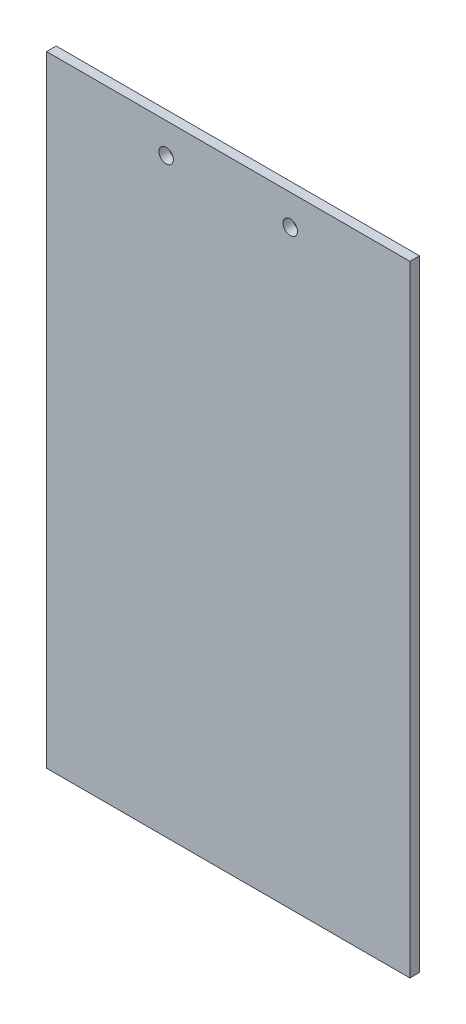
ISO-10303-21;
HEADER;
FILE_DESCRIPTION(('STEP AP214'),'2;1');
FILE_NAME('part.step','',(''),(''),'','','');
FILE_SCHEMA(('AUTOMOTIVE_DESIGN { 1 0 10303 214 1 1 1 1 }'));
ENDSEC;
DATA;
#1=APPLICATION_CONTEXT('core data for automotive mechanical design processes');
#2=APPLICATION_PROTOCOL_DEFINITION('international standard','automotive_design',2000,#1);
#3=PRODUCT_CONTEXT('',#1,'mechanical');
#4=PRODUCT('Part','Part','',(#3));
#5=PRODUCT_RELATED_PRODUCT_CATEGORY('part','',(#4));
#6=PRODUCT_DEFINITION_FORMATION('','',#4);
#7=PRODUCT_DEFINITION_CONTEXT('part definition',#1,'design');
#8=PRODUCT_DEFINITION('design','',#6,#7);
#9=PRODUCT_DEFINITION_SHAPE('','',#8);
#10=(LENGTH_UNIT() NAMED_UNIT(*) SI_UNIT(.MILLI.,.METRE.));
#11=(NAMED_UNIT(*) PLANE_ANGLE_UNIT() SI_UNIT($,.RADIAN.));
#12=(NAMED_UNIT(*) SI_UNIT($,.STERADIAN.) SOLID_ANGLE_UNIT());
#13=UNCERTAINTY_MEASURE_WITH_UNIT(LENGTH_MEASURE(1.E-05),#10,'distance_accuracy_value','');
#14=(GEOMETRIC_REPRESENTATION_CONTEXT(3) GLOBAL_UNCERTAINTY_ASSIGNED_CONTEXT((#13)) GLOBAL_UNIT_ASSIGNED_CONTEXT((#10,
#11,#12)) REPRESENTATION_CONTEXT('',''));
#15=CARTESIAN_POINT('',(0.,0.,0.));
#16=DIRECTION('',(0.,0.,1.));
#17=DIRECTION('',(1.,0.,0.));
#18=AXIS2_PLACEMENT_3D('',#15,#16,#17);
#19=CARTESIAN_POINT('',(0.,0.,6.35));
#20=DIRECTION('',(1.,0.,0.));
#21=DIRECTION('',(0.,1.,0.));
#22=AXIS2_PLACEMENT_3D('',#19,#20,#21);
#23=PLANE('',#22);
#24=DIRECTION('',(0.,-1.,0.));
#25=VECTOR('',#24,1.);
#26=CARTESIAN_POINT('',(0.,0.,0.));
#27=LINE('',#26,#25);
#28=CARTESIAN_POINT('',(0.,0.,0.));
#29=VERTEX_POINT('',#28);
#30=CARTESIAN_POINT('',(0.,-410.,0.));
#31=VERTEX_POINT('',#30);
#32=EDGE_CURVE('E100',#29,#31,#27,.T.);
#33=ORIENTED_EDGE('',*,*,#32,.T.);
#34=DIRECTION('',(0.,0.,-1.));
#35=VECTOR('',#34,1.);
#36=CARTESIAN_POINT('',(0.,-410.,6.35));
#37=LINE('',#36,#35);
#38=CARTESIAN_POINT('',(0.,-410.,6.35));
#39=VERTEX_POINT('',#38);
#40=EDGE_CURVE('E11',#39,#31,#37,.T.);
#41=ORIENTED_EDGE('',*,*,#40,.F.);
#42=DIRECTION('',(0.,-1.,0.));
#43=VECTOR('',#42,1.);
#44=CARTESIAN_POINT('',(0.,0.,6.35));
#45=LINE('',#44,#43);
#46=CARTESIAN_POINT('',(0.,0.,6.35));
#47=VERTEX_POINT('',#46);
#48=EDGE_CURVE('E87',#47,#39,#45,.T.);
#49=ORIENTED_EDGE('',*,*,#48,.F.);
#50=DIRECTION('',(0.,0.,-1.));
#51=VECTOR('',#50,1.);
#52=CARTESIAN_POINT('',(0.,0.,6.35));
#53=LINE('',#52,#51);
#54=EDGE_CURVE('E96',#47,#29,#53,.T.);
#55=ORIENTED_EDGE('',*,*,#54,.T.);
#56=EDGE_LOOP('',(#33,#41,#49,#55));
#57=FACE_BOUND('',#56,.T.);
#58=ADVANCED_FACE('F34',(#57),#23,.F.);
#59=CARTESIAN_POINT('',(0.,-410.,6.35));
#60=DIRECTION('',(0.,1.,0.));
#61=DIRECTION('',(0.,0.,1.));
#62=AXIS2_PLACEMENT_3D('',#59,#60,#61);
#63=PLANE('',#62);
#64=DIRECTION('',(1.,0.,0.));
#65=VECTOR('',#64,1.);
#66=CARTESIAN_POINT('',(0.,-410.,0.));
#67=LINE('',#66,#65);
#68=CARTESIAN_POINT('',(240.,-410.,0.));
#69=VERTEX_POINT('',#68);
#70=EDGE_CURVE('E91',#31,#69,#67,.T.);
#71=ORIENTED_EDGE('',*,*,#70,.T.);
#72=DIRECTION('',(0.,0.,-1.));
#73=VECTOR('',#72,1.);
#74=CARTESIAN_POINT('',(240.,-410.,6.35));
#75=LINE('',#74,#73);
#76=CARTESIAN_POINT('',(240.,-410.,6.35));
#77=VERTEX_POINT('',#76);
#78=EDGE_CURVE('E43',#77,#69,#75,.T.);
#79=ORIENTED_EDGE('',*,*,#78,.F.);
#80=DIRECTION('',(1.,0.,0.));
#81=VECTOR('',#80,1.);
#82=CARTESIAN_POINT('',(0.,-410.,6.35));
#83=LINE('',#82,#81);
#84=EDGE_CURVE('E82',#39,#77,#83,.T.);
#85=ORIENTED_EDGE('',*,*,#84,.F.);
#86=ORIENTED_EDGE('',*,*,#40,.T.);
#87=EDGE_LOOP('',(#71,#79,#85,#86));
#88=FACE_BOUND('',#87,.T.);
#89=ADVANCED_FACE('F90',(#88),#63,.F.);
#90=CARTESIAN_POINT('',(240.,0.,6.35));
#91=DIRECTION('',(-1.,0.,0.));
#92=DIRECTION('',(0.,-1.,0.));
#93=AXIS2_PLACEMENT_3D('',#90,#91,#92);
#94=PLANE('',#93);
#95=DIRECTION('',(0.,1.,0.));
#96=VECTOR('',#95,1.);
#97=CARTESIAN_POINT('',(240.,0.,0.));
#98=LINE('',#97,#96);
#99=CARTESIAN_POINT('',(240.,0.,0.));
#100=VERTEX_POINT('',#99);
#101=EDGE_CURVE('E69',#69,#100,#98,.T.);
#102=ORIENTED_EDGE('',*,*,#101,.T.);
#103=DIRECTION('',(0.,0.,-1.));
#104=VECTOR('',#103,1.);
#105=CARTESIAN_POINT('',(240.,0.,6.35));
#106=LINE('',#105,#104);
#107=CARTESIAN_POINT('',(240.,0.,6.35));
#108=VERTEX_POINT('',#107);
#109=EDGE_CURVE('E92',#108,#100,#106,.T.);
#110=ORIENTED_EDGE('',*,*,#109,.F.);
#111=DIRECTION('',(0.,1.,0.));
#112=VECTOR('',#111,1.);
#113=CARTESIAN_POINT('',(240.,0.,6.35));
#114=LINE('',#113,#112);
#115=EDGE_CURVE('E85',#77,#108,#114,.T.);
#116=ORIENTED_EDGE('',*,*,#115,.F.);
#117=ORIENTED_EDGE('',*,*,#78,.T.);
#118=EDGE_LOOP('',(#102,#110,#116,#117));
#119=FACE_BOUND('',#118,.T.);
#120=ADVANCED_FACE('F94',(#119),#94,.F.);
#121=CARTESIAN_POINT('',(0.,0.,6.35));
#122=DIRECTION('',(0.,-1.,0.));
#123=DIRECTION('',(0.,0.,-1.));
#124=AXIS2_PLACEMENT_3D('',#121,#122,#123);
#125=PLANE('',#124);
#126=DIRECTION('',(-1.,0.,0.));
#127=VECTOR('',#126,1.);
#128=CARTESIAN_POINT('',(0.,0.,0.));
#129=LINE('',#128,#127);
#130=EDGE_CURVE('E75',#100,#29,#129,.T.);
#131=ORIENTED_EDGE('',*,*,#130,.T.);
#132=ORIENTED_EDGE('',*,*,#54,.F.);
#133=DIRECTION('',(-1.,0.,0.));
#134=VECTOR('',#133,1.);
#135=CARTESIAN_POINT('',(0.,0.,6.35));
#136=LINE('',#135,#134);
#137=EDGE_CURVE('E52',#108,#47,#136,.T.);
#138=ORIENTED_EDGE('',*,*,#137,.F.);
#139=ORIENTED_EDGE('',*,*,#109,.T.);
#140=EDGE_LOOP('',(#131,#132,#138,#139));
#141=FACE_BOUND('',#140,.T.);
#142=ADVANCED_FACE('F128',(#141),#125,.F.);
#143=CARTESIAN_POINT('',(0.,0.,6.35));
#144=DIRECTION('',(0.,0.,1.));
#145=DIRECTION('',(1.,0.,0.));
#146=AXIS2_PLACEMENT_3D('',#143,#144,#145);
#147=PLANE('',#146);
#148=CARTESIAN_POINT('',(79.,-20.,6.35));
#149=DIRECTION('',(0.,0.,1.));
#150=DIRECTION('',(1.,0.,0.));
#151=AXIS2_PLACEMENT_3D('',#148,#149,#150);
#152=CIRCLE('',#151,4.7625);
#153=CARTESIAN_POINT('',(83.7625,-20.,6.35));
#154=VERTEX_POINT('',#153);
#155=EDGE_CURVE('E117',#154,#154,#152,.T.);
#156=ORIENTED_EDGE('',*,*,#155,.F.);
#157=EDGE_LOOP('',(#156));
#158=FACE_BOUND('',#157,.T.);
#159=CARTESIAN_POINT('',(161.,-20.,6.35));
#160=DIRECTION('',(0.,0.,1.));
#161=DIRECTION('',(1.,0.,0.));
#162=AXIS2_PLACEMENT_3D('',#159,#160,#161);
#163=CIRCLE('',#162,4.76250000000001);
#164=CARTESIAN_POINT('',(165.7625,-20.,6.35));
#165=VERTEX_POINT('',#164);
#166=EDGE_CURVE('E109',#165,#165,#163,.T.);
#167=ORIENTED_EDGE('',*,*,#166,.F.);
#168=EDGE_LOOP('',(#167));
#169=FACE_BOUND('',#168,.T.);
#170=ORIENTED_EDGE('',*,*,#48,.T.);
#171=ORIENTED_EDGE('',*,*,#84,.T.);
#172=ORIENTED_EDGE('',*,*,#115,.T.);
#173=ORIENTED_EDGE('',*,*,#137,.T.);
#174=EDGE_LOOP('',(#170,#171,#172,#173));
#175=FACE_BOUND('',#174,.T.);
#176=ADVANCED_FACE('F83',(#158,#169,#175),#147,.T.);
#177=CARTESIAN_POINT('',(0.,0.,0.));
#178=DIRECTION('',(0.,0.,1.));
#179=DIRECTION('',(1.,0.,0.));
#180=AXIS2_PLACEMENT_3D('',#177,#178,#179);
#181=PLANE('',#180);
#182=CARTESIAN_POINT('',(79.,-20.,0.));
#183=DIRECTION('',(0.,0.,1.));
#184=DIRECTION('',(1.,0.,0.));
#185=AXIS2_PLACEMENT_3D('',#182,#183,#184);
#186=CIRCLE('',#185,4.7625);
#187=CARTESIAN_POINT('',(83.7625,-20.,0.));
#188=VERTEX_POINT('',#187);
#189=EDGE_CURVE('E37',#188,#188,#186,.T.);
#190=ORIENTED_EDGE('',*,*,#189,.T.);
#191=EDGE_LOOP('',(#190));
#192=FACE_BOUND('',#191,.T.);
#193=CARTESIAN_POINT('',(161.,-20.,0.));
#194=DIRECTION('',(0.,0.,1.));
#195=DIRECTION('',(1.,0.,0.));
#196=AXIS2_PLACEMENT_3D('',#193,#194,#195);
#197=CIRCLE('',#196,4.76250000000001);
#198=CARTESIAN_POINT('',(165.7625,-20.,0.));
#199=VERTEX_POINT('',#198);
#200=EDGE_CURVE('E103',#199,#199,#197,.T.);
#201=ORIENTED_EDGE('',*,*,#200,.T.);
#202=EDGE_LOOP('',(#201));
#203=FACE_BOUND('',#202,.T.);
#204=ORIENTED_EDGE('',*,*,#32,.F.);
#205=ORIENTED_EDGE('',*,*,#130,.F.);
#206=ORIENTED_EDGE('',*,*,#101,.F.);
#207=ORIENTED_EDGE('',*,*,#70,.F.);
#208=EDGE_LOOP('',(#204,#205,#206,#207));
#209=FACE_BOUND('',#208,.T.);
#210=ADVANCED_FACE('F127',(#192,#203,#209),#181,.F.);
#211=CARTESIAN_POINT('',(161.,-20.,-3.65));
#212=DIRECTION('',(0.,0.,1.));
#213=DIRECTION('',(1.,0.,0.));
#214=AXIS2_PLACEMENT_3D('',#211,#212,#213);
#215=CYLINDRICAL_SURFACE('',#214,4.76250000000001);
#216=ORIENTED_EDGE('',*,*,#166,.T.);
#217=EDGE_LOOP('',(#216));
#218=FACE_BOUND('',#217,.T.);
#219=ORIENTED_EDGE('',*,*,#200,.F.);
#220=EDGE_LOOP('',(#219));
#221=FACE_BOUND('',#220,.T.);
#222=ADVANCED_FACE('F134',(#218,#221),#215,.F.);
#223=CARTESIAN_POINT('',(79.,-20.,-3.65));
#224=DIRECTION('',(0.,0.,1.));
#225=DIRECTION('',(1.,0.,0.));
#226=AXIS2_PLACEMENT_3D('',#223,#224,#225);
#227=CYLINDRICAL_SURFACE('',#226,4.7625);
#228=ORIENTED_EDGE('',*,*,#155,.T.);
#229=EDGE_LOOP('',(#228));
#230=FACE_BOUND('',#229,.T.);
#231=ORIENTED_EDGE('',*,*,#189,.F.);
#232=EDGE_LOOP('',(#231));
#233=FACE_BOUND('',#232,.T.);
#234=ADVANCED_FACE('F122',(#230,#233),#227,.F.);
#235=CLOSED_SHELL('',(#58,#89,#120,#142,#176,#210,#222,#234));
#236=MANIFOLD_SOLID_BREP('B2',#235);
#237=ADVANCED_BREP_SHAPE_REPRESENTATION('',(#18,#236),#14);
#238=SHAPE_DEFINITION_REPRESENTATION(#9,#237);
ENDSEC;
END-ISO-10303-21;
